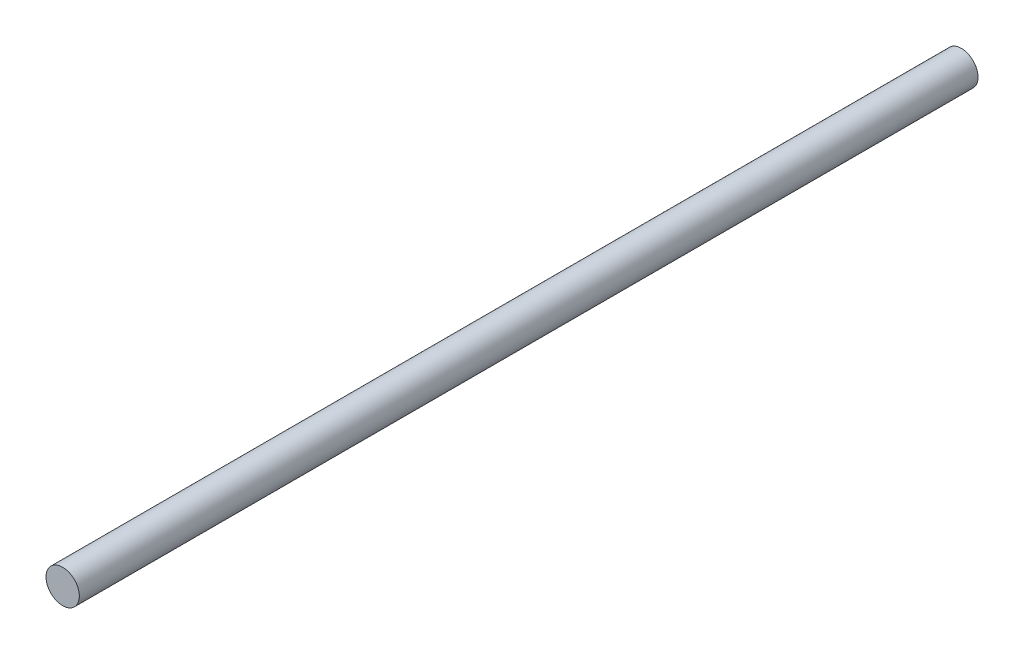
ISO-10303-21;
HEADER;
FILE_DESCRIPTION(('STEP AP214'),'2;1');
FILE_NAME('part.step','',(''),(''),'','','');
FILE_SCHEMA(('AUTOMOTIVE_DESIGN { 1 0 10303 214 1 1 1 1 }'));
ENDSEC;
DATA;
#1=APPLICATION_CONTEXT('core data for automotive mechanical design processes');
#2=APPLICATION_PROTOCOL_DEFINITION('international standard','automotive_design',2000,#1);
#3=PRODUCT_CONTEXT('',#1,'mechanical');
#4=PRODUCT('Part','Part','',(#3));
#5=PRODUCT_RELATED_PRODUCT_CATEGORY('part','',(#4));
#6=PRODUCT_DEFINITION_FORMATION('','',#4);
#7=PRODUCT_DEFINITION_CONTEXT('part definition',#1,'design');
#8=PRODUCT_DEFINITION('design','',#6,#7);
#9=PRODUCT_DEFINITION_SHAPE('','',#8);
#10=(LENGTH_UNIT() NAMED_UNIT(*) SI_UNIT(.MILLI.,.METRE.));
#11=(NAMED_UNIT(*) PLANE_ANGLE_UNIT() SI_UNIT($,.RADIAN.));
#12=(NAMED_UNIT(*) SI_UNIT($,.STERADIAN.) SOLID_ANGLE_UNIT());
#13=UNCERTAINTY_MEASURE_WITH_UNIT(LENGTH_MEASURE(1.E-05),#10,'distance_accuracy_value','');
#14=(GEOMETRIC_REPRESENTATION_CONTEXT(3) GLOBAL_UNCERTAINTY_ASSIGNED_CONTEXT((#13)) GLOBAL_UNIT_ASSIGNED_CONTEXT((#10,
#11,#12)) REPRESENTATION_CONTEXT('',''));
#15=CARTESIAN_POINT('',(0.,0.,0.));
#16=DIRECTION('',(0.,0.,1.));
#17=DIRECTION('',(1.,0.,0.));
#18=AXIS2_PLACEMENT_3D('',#15,#16,#17);
#19=CARTESIAN_POINT('',(0.,0.,205.));
#20=DIRECTION('',(0.,0.,-1.));
#21=DIRECTION('',(-1.,0.,0.));
#22=AXIS2_PLACEMENT_3D('',#19,#20,#21);
#23=CYLINDRICAL_SURFACE('',#22,3.8);
#24=CARTESIAN_POINT('',(0.,0.,205.));
#25=DIRECTION('',(0.,0.,1.));
#26=DIRECTION('',(1.,0.,0.));
#27=AXIS2_PLACEMENT_3D('',#24,#25,#26);
#28=CIRCLE('',#27,3.8);
#29=CARTESIAN_POINT('',(-3.8,0.,205.));
#30=VERTEX_POINT('',#29);
#31=EDGE_CURVE('E10',#30,#30,#28,.T.);
#32=CARTESIAN_POINT('',(0.,0.,0.));
#33=DIRECTION('',(0.,0.,1.));
#34=DIRECTION('',(1.,0.,0.));
#35=AXIS2_PLACEMENT_3D('',#32,#33,#34);
#36=CIRCLE('',#35,3.8);
#37=CARTESIAN_POINT('',(-3.8,0.,0.));
#38=VERTEX_POINT('',#37);
#39=EDGE_CURVE('E40',#38,#38,#36,.T.);
#40=CARTESIAN_POINT('',(-3.8,0.,205.));
#41=CARTESIAN_POINT('',(-3.8,0.,202.864583333333));
#42=CARTESIAN_POINT('',(-3.8,0.,200.729166666667));
#43=CARTESIAN_POINT('',(-3.8,0.,196.458333333333));
#44=CARTESIAN_POINT('',(-3.8,0.,194.322916666667));
#45=CARTESIAN_POINT('',(-3.8,0.,190.052083333333));
#46=CARTESIAN_POINT('',(-3.8,0.,187.916666666667));
#47=CARTESIAN_POINT('',(-3.8,0.,183.645833333333));
#48=CARTESIAN_POINT('',(-3.8,0.,181.510416666667));
#49=CARTESIAN_POINT('',(-3.8,0.,177.239583333333));
#50=CARTESIAN_POINT('',(-3.8,0.,175.104166666667));
#51=CARTESIAN_POINT('',(-3.8,0.,170.833333333333));
#52=CARTESIAN_POINT('',(-3.8,0.,168.697916666667));
#53=CARTESIAN_POINT('',(-3.8,0.,164.427083333333));
#54=CARTESIAN_POINT('',(-3.8,0.,162.291666666667));
#55=CARTESIAN_POINT('',(-3.8,0.,158.020833333333));
#56=CARTESIAN_POINT('',(-3.8,0.,155.885416666667));
#57=CARTESIAN_POINT('',(-3.8,0.,151.614583333333));
#58=CARTESIAN_POINT('',(-3.8,0.,149.479166666667));
#59=CARTESIAN_POINT('',(-3.8,0.,145.208333333333));
#60=CARTESIAN_POINT('',(-3.8,0.,143.072916666667));
#61=CARTESIAN_POINT('',(-3.8,0.,138.802083333333));
#62=CARTESIAN_POINT('',(-3.8,0.,136.666666666667));
#63=CARTESIAN_POINT('',(-3.8,0.,132.395833333333));
#64=CARTESIAN_POINT('',(-3.8,0.,130.260416666667));
#65=CARTESIAN_POINT('',(-3.8,0.,125.989583333333));
#66=CARTESIAN_POINT('',(-3.8,0.,123.854166666667));
#67=CARTESIAN_POINT('',(-3.8,0.,119.583333333333));
#68=CARTESIAN_POINT('',(-3.8,0.,117.447916666667));
#69=CARTESIAN_POINT('',(-3.8,0.,113.177083333333));
#70=CARTESIAN_POINT('',(-3.8,0.,111.041666666667));
#71=CARTESIAN_POINT('',(-3.8,0.,106.770833333333));
#72=CARTESIAN_POINT('',(-3.8,0.,104.635416666667));
#73=CARTESIAN_POINT('',(-3.8,0.,100.364583333333));
#74=CARTESIAN_POINT('',(-3.8,0.,98.2291666666666));
#75=CARTESIAN_POINT('',(-3.8,0.,93.9583333333333));
#76=CARTESIAN_POINT('',(-3.8,0.,91.8229166666666));
#77=CARTESIAN_POINT('',(-3.8,0.,87.5520833333333));
#78=CARTESIAN_POINT('',(-3.8,0.,85.4166666666666));
#79=CARTESIAN_POINT('',(-3.8,0.,81.1458333333333));
#80=CARTESIAN_POINT('',(-3.8,0.,79.0104166666667));
#81=CARTESIAN_POINT('',(-3.8,0.,74.7395833333333));
#82=CARTESIAN_POINT('',(-3.8,0.,72.6041666666667));
#83=CARTESIAN_POINT('',(-3.8,0.,68.3333333333333));
#84=CARTESIAN_POINT('',(-3.8,0.,66.1979166666667));
#85=CARTESIAN_POINT('',(-3.8,0.,61.9270833333333));
#86=CARTESIAN_POINT('',(-3.8,0.,59.7916666666667));
#87=CARTESIAN_POINT('',(-3.8,0.,55.5208333333333));
#88=CARTESIAN_POINT('',(-3.8,0.,53.3854166666667));
#89=CARTESIAN_POINT('',(-3.8,0.,49.1145833333333));
#90=CARTESIAN_POINT('',(-3.8,0.,46.9791666666667));
#91=CARTESIAN_POINT('',(-3.8,0.,42.7083333333333));
#92=CARTESIAN_POINT('',(-3.8,0.,40.5729166666667));
#93=CARTESIAN_POINT('',(-3.8,0.,36.3020833333333));
#94=CARTESIAN_POINT('',(-3.8,0.,34.1666666666667));
#95=CARTESIAN_POINT('',(-3.8,0.,29.8958333333333));
#96=CARTESIAN_POINT('',(-3.8,0.,27.7604166666667));
#97=CARTESIAN_POINT('',(-3.8,0.,23.4895833333333));
#98=CARTESIAN_POINT('',(-3.8,0.,21.3541666666667));
#99=CARTESIAN_POINT('',(-3.8,0.,17.0833333333333));
#100=CARTESIAN_POINT('',(-3.8,0.,14.9479166666667));
#101=CARTESIAN_POINT('',(-3.8,0.,10.6770833333333));
#102=CARTESIAN_POINT('',(-3.8,0.,8.54166666666667));
#103=CARTESIAN_POINT('',(-3.8,0.,4.27083333333333));
#104=CARTESIAN_POINT('',(-3.8,0.,2.13541666666667));
#105=CARTESIAN_POINT('',(-3.8,0.,0.));
#106=B_SPLINE_CURVE_WITH_KNOTS('',3,(#40,#41,#42,#43,#44,#45,#46,#47,#48,#49,#50,#51,#52,#53,
#54,#55,#56,#57,#58,#59,#60,#61,#62,#63,#64,#65,#66,#67,#68,#69,#70,#71,#72,#73,#74,#75,#76,#77,
#78,#79,#80,#81,#82,#83,#84,#85,#86,#87,#88,#89,#90,#91,#92,#93,#94,#95,#96,#97,#98,#99,#100,
#101,#102,#103,#104,#105),.UNSPECIFIED.,.F.,.F.,(4,2,2,2,2,2,2,2,2,2,2,2,2,2,2,2,2,2,2,2,2,2,2,
2,2,2,2,2,2,2,2,2,4),(0.,6.40625,12.8125,19.21875,25.625,32.03125,38.4375,44.84375,51.25,
57.65625,64.0625,70.46875,76.875,83.28125,89.6875,96.09375,102.5,108.90625,115.3125,121.71875,
128.125,134.53125,140.9375,147.34375,153.75,160.15625,166.5625,172.96875,179.375,185.78125,
192.1875,198.59375,205.),.UNSPECIFIED.);
#107=EDGE_CURVE('BSEAM37',#30,#38,#106,.T.);
#108=ORIENTED_EDGE('',*,*,#31,.F.);
#109=ORIENTED_EDGE('',*,*,#39,.T.);
#110=ORIENTED_EDGE('',*,*,#107,.T.);
#111=ORIENTED_EDGE('',*,*,#107,.F.);
#112=EDGE_LOOP('',(#108,#110,#109,#111));
#113=FACE_BOUND('',#112,.T.);
#114=ADVANCED_FACE('F37',(#113),#23,.T.);
#115=CARTESIAN_POINT('',(0.,0.,205.));
#116=DIRECTION('',(0.,0.,1.));
#117=DIRECTION('',(1.,0.,0.));
#118=AXIS2_PLACEMENT_3D('',#115,#116,#117);
#119=PLANE('',#118);
#120=ORIENTED_EDGE('',*,*,#31,.T.);
#121=EDGE_LOOP('',(#120));
#122=FACE_BOUND('',#121,.T.);
#123=ADVANCED_FACE('F52',(#122),#119,.T.);
#124=CARTESIAN_POINT('',(0.,0.,0.));
#125=DIRECTION('',(0.,0.,1.));
#126=DIRECTION('',(1.,0.,0.));
#127=AXIS2_PLACEMENT_3D('',#124,#125,#126);
#128=PLANE('',#127);
#129=ORIENTED_EDGE('',*,*,#39,.F.);
#130=EDGE_LOOP('',(#129));
#131=FACE_BOUND('',#130,.T.);
#132=ADVANCED_FACE('F50',(#131),#128,.F.);
#133=CLOSED_SHELL('',(#114,#123,#132));
#134=MANIFOLD_SOLID_BREP('B2',#133);
#135=ADVANCED_BREP_SHAPE_REPRESENTATION('',(#18,#134),#14);
#136=SHAPE_DEFINITION_REPRESENTATION(#9,#135);
ENDSEC;
END-ISO-10303-21;
